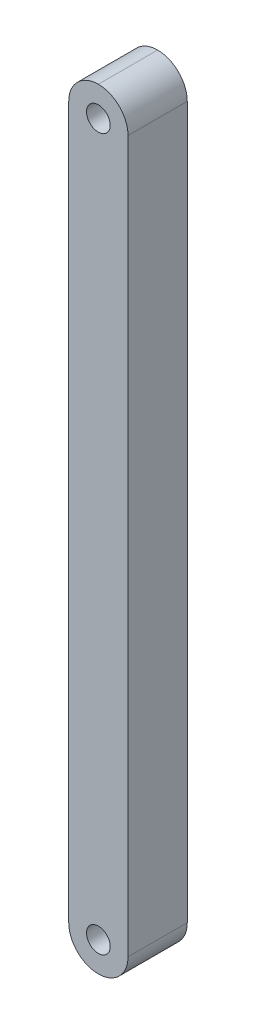
ISO-10303-21;
HEADER;
FILE_DESCRIPTION(('STEP AP214'),'2;1');
FILE_NAME('part.step','',(''),(''),'','','');
FILE_SCHEMA(('AUTOMOTIVE_DESIGN { 1 0 10303 214 1 1 1 1 }'));
ENDSEC;
DATA;
#1=APPLICATION_CONTEXT('core data for automotive mechanical design processes');
#2=APPLICATION_PROTOCOL_DEFINITION('international standard','automotive_design',2000,#1);
#3=PRODUCT_CONTEXT('',#1,'mechanical');
#4=PRODUCT('Part','Part','',(#3));
#5=PRODUCT_RELATED_PRODUCT_CATEGORY('part','',(#4));
#6=PRODUCT_DEFINITION_FORMATION('','',#4);
#7=PRODUCT_DEFINITION_CONTEXT('part definition',#1,'design');
#8=PRODUCT_DEFINITION('design','',#6,#7);
#9=PRODUCT_DEFINITION_SHAPE('','',#8);
#10=(LENGTH_UNIT() NAMED_UNIT(*) SI_UNIT(.MILLI.,.METRE.));
#11=(NAMED_UNIT(*) PLANE_ANGLE_UNIT() SI_UNIT($,.RADIAN.));
#12=(NAMED_UNIT(*) SI_UNIT($,.STERADIAN.) SOLID_ANGLE_UNIT());
#13=UNCERTAINTY_MEASURE_WITH_UNIT(LENGTH_MEASURE(1.E-05),#10,'distance_accuracy_value','');
#14=(GEOMETRIC_REPRESENTATION_CONTEXT(3) GLOBAL_UNCERTAINTY_ASSIGNED_CONTEXT((#13)) GLOBAL_UNIT_ASSIGNED_CONTEXT((#10,
#11,#12)) REPRESENTATION_CONTEXT('',''));
#15=CARTESIAN_POINT('',(0.,0.,0.));
#16=DIRECTION('',(0.,0.,1.));
#17=DIRECTION('',(1.,0.,0.));
#18=AXIS2_PLACEMENT_3D('',#15,#16,#17);
#19=CARTESIAN_POINT('',(0.,0.,10.));
#20=DIRECTION('',(1.,0.,0.));
#21=DIRECTION('',(0.,0.,-1.));
#22=AXIS2_PLACEMENT_3D('',#19,#20,#21);
#23=PLANE('',#22);
#24=DIRECTION('',(0.,-1.,0.));
#25=VECTOR('',#24,1.);
#26=CARTESIAN_POINT('',(0.,0.,0.));
#27=LINE('',#26,#25);
#28=CARTESIAN_POINT('',(0.,125.,0.));
#29=VERTEX_POINT('',#28);
#30=CARTESIAN_POINT('',(0.,5.,0.));
#31=VERTEX_POINT('',#30);
#32=EDGE_CURVE('E114',#29,#31,#27,.T.);
#33=ORIENTED_EDGE('',*,*,#32,.T.);
#34=DIRECTION('',(0.,0.,-1.));
#35=VECTOR('',#34,1.);
#36=CARTESIAN_POINT('',(0.,5.,10.));
#37=LINE('',#36,#35);
#38=CARTESIAN_POINT('',(0.,5.,10.));
#39=VERTEX_POINT('',#38);
#40=EDGE_CURVE('E11',#31,#39,#37,.F.);
#41=ORIENTED_EDGE('',*,*,#40,.T.);
#42=DIRECTION('',(0.,-1.,0.));
#43=VECTOR('',#42,1.);
#44=CARTESIAN_POINT('',(0.,0.,10.));
#45=LINE('',#44,#43);
#46=CARTESIAN_POINT('',(0.,125.,10.));
#47=VERTEX_POINT('',#46);
#48=EDGE_CURVE('E113',#47,#39,#45,.T.);
#49=ORIENTED_EDGE('',*,*,#48,.F.);
#50=DIRECTION('',(0.,0.,-1.));
#51=VECTOR('',#50,1.);
#52=CARTESIAN_POINT('',(0.,125.,10.));
#53=LINE('',#52,#51);
#54=EDGE_CURVE('E42',#47,#29,#53,.T.);
#55=ORIENTED_EDGE('',*,*,#54,.T.);
#56=EDGE_LOOP('',(#33,#41,#49,#55));
#57=FACE_BOUND('',#56,.T.);
#58=ADVANCED_FACE('F33',(#57),#23,.F.);
#59=CARTESIAN_POINT('',(10.,0.,10.));
#60=DIRECTION('',(-1.,0.,0.));
#61=DIRECTION('',(0.,0.,1.));
#62=AXIS2_PLACEMENT_3D('',#59,#60,#61);
#63=PLANE('',#62);
#64=DIRECTION('',(0.,1.,0.));
#65=VECTOR('',#64,1.);
#66=CARTESIAN_POINT('',(10.,0.,10.));
#67=LINE('',#66,#65);
#68=CARTESIAN_POINT('',(10.,5.,10.));
#69=VERTEX_POINT('',#68);
#70=CARTESIAN_POINT('',(10.,125.,10.));
#71=VERTEX_POINT('',#70);
#72=EDGE_CURVE('E106',#69,#71,#67,.T.);
#73=ORIENTED_EDGE('',*,*,#72,.F.);
#74=DIRECTION('',(0.,0.,-1.));
#75=VECTOR('',#74,1.);
#76=CARTESIAN_POINT('',(10.,5.,10.));
#77=LINE('',#76,#75);
#78=CARTESIAN_POINT('',(10.,5.,0.));
#79=VERTEX_POINT('',#78);
#80=EDGE_CURVE('E91',#69,#79,#77,.T.);
#81=ORIENTED_EDGE('',*,*,#80,.T.);
#82=DIRECTION('',(0.,1.,0.));
#83=VECTOR('',#82,1.);
#84=CARTESIAN_POINT('',(10.,0.,0.));
#85=LINE('',#84,#83);
#86=CARTESIAN_POINT('',(10.,125.,0.));
#87=VERTEX_POINT('',#86);
#88=EDGE_CURVE('E104',#79,#87,#85,.T.);
#89=ORIENTED_EDGE('',*,*,#88,.T.);
#90=DIRECTION('',(0.,0.,-1.));
#91=VECTOR('',#90,1.);
#92=CARTESIAN_POINT('',(10.,125.,10.));
#93=LINE('',#92,#91);
#94=EDGE_CURVE('E108',#87,#71,#93,.F.);
#95=ORIENTED_EDGE('',*,*,#94,.T.);
#96=EDGE_LOOP('',(#73,#81,#89,#95));
#97=FACE_BOUND('',#96,.T.);
#98=ADVANCED_FACE('F102',(#97),#63,.F.);
#99=CARTESIAN_POINT('',(0.,0.,10.));
#100=DIRECTION('',(0.,0.,-1.));
#101=DIRECTION('',(-1.,0.,0.));
#102=AXIS2_PLACEMENT_3D('',#99,#100,#101);
#103=PLANE('',#102);
#104=CARTESIAN_POINT('',(5.,5.,10.));
#105=DIRECTION('',(0.,0.,1.));
#106=DIRECTION('',(1.,0.,0.));
#107=AXIS2_PLACEMENT_3D('',#104,#105,#106);
#108=CIRCLE('',#107,2.);
#109=CARTESIAN_POINT('',(7.,5.,10.));
#110=VERTEX_POINT('',#109);
#111=EDGE_CURVE('E131',#110,#110,#108,.T.);
#112=ORIENTED_EDGE('',*,*,#111,.F.);
#113=EDGE_LOOP('',(#112));
#114=FACE_BOUND('',#113,.T.);
#115=CARTESIAN_POINT('',(5.,125.,10.));
#116=DIRECTION('',(0.,0.,1.));
#117=DIRECTION('',(1.,0.,0.));
#118=AXIS2_PLACEMENT_3D('',#115,#116,#117);
#119=CIRCLE('',#118,2.);
#120=CARTESIAN_POINT('',(7.,125.,10.));
#121=VERTEX_POINT('',#120);
#122=EDGE_CURVE('E150',#121,#121,#119,.T.);
#123=ORIENTED_EDGE('',*,*,#122,.F.);
#124=EDGE_LOOP('',(#123));
#125=FACE_BOUND('',#124,.T.);
#126=CARTESIAN_POINT('',(5.,5.,10.));
#127=DIRECTION('',(0.,0.,-1.));
#128=DIRECTION('',(-1.,0.,0.));
#129=AXIS2_PLACEMENT_3D('',#126,#127,#128);
#130=CIRCLE('',#129,5.);
#131=CARTESIAN_POINT('',(5.,0.,10.));
#132=VERTEX_POINT('',#131);
#133=EDGE_CURVE('E57',#39,#132,#130,.F.);
#134=ORIENTED_EDGE('',*,*,#133,.T.);
#135=CARTESIAN_POINT('',(5.,5.,10.));
#136=DIRECTION('',(0.,0.,-1.));
#137=DIRECTION('',(-1.,0.,0.));
#138=AXIS2_PLACEMENT_3D('',#135,#136,#137);
#139=CIRCLE('',#138,5.);
#140=EDGE_CURVE('E129',#132,#69,#139,.F.);
#141=ORIENTED_EDGE('',*,*,#140,.T.);
#142=ORIENTED_EDGE('',*,*,#72,.T.);
#143=CARTESIAN_POINT('',(5.,125.,10.));
#144=DIRECTION('',(0.,0.,-1.));
#145=DIRECTION('',(-1.,0.,0.));
#146=AXIS2_PLACEMENT_3D('',#143,#144,#145);
#147=CIRCLE('',#146,5.);
#148=CARTESIAN_POINT('',(5.,130.,10.));
#149=VERTEX_POINT('',#148);
#150=EDGE_CURVE('E50',#71,#149,#147,.F.);
#151=ORIENTED_EDGE('',*,*,#150,.T.);
#152=CARTESIAN_POINT('',(5.,125.,10.));
#153=DIRECTION('',(0.,0.,-1.));
#154=DIRECTION('',(-1.,0.,0.));
#155=AXIS2_PLACEMENT_3D('',#152,#153,#154);
#156=CIRCLE('',#155,5.);
#157=EDGE_CURVE('E96',#149,#47,#156,.F.);
#158=ORIENTED_EDGE('',*,*,#157,.T.);
#159=ORIENTED_EDGE('',*,*,#48,.T.);
#160=EDGE_LOOP('',(#134,#141,#142,#151,#158,#159));
#161=FACE_BOUND('',#160,.T.);
#162=ADVANCED_FACE('F143',(#114,#125,#161),#103,.F.);
#163=CARTESIAN_POINT('',(0.,0.,0.));
#164=DIRECTION('',(0.,0.,-1.));
#165=DIRECTION('',(-1.,0.,0.));
#166=AXIS2_PLACEMENT_3D('',#163,#164,#165);
#167=PLANE('',#166);
#168=CARTESIAN_POINT('',(5.,5.,0.));
#169=DIRECTION('',(0.,0.,1.));
#170=DIRECTION('',(1.,0.,0.));
#171=AXIS2_PLACEMENT_3D('',#168,#169,#170);
#172=CIRCLE('',#171,2.);
#173=CARTESIAN_POINT('',(7.,5.,0.));
#174=VERTEX_POINT('',#173);
#175=EDGE_CURVE('E133',#174,#174,#172,.T.);
#176=ORIENTED_EDGE('',*,*,#175,.T.);
#177=EDGE_LOOP('',(#176));
#178=FACE_BOUND('',#177,.T.);
#179=CARTESIAN_POINT('',(5.,125.,0.));
#180=DIRECTION('',(0.,0.,1.));
#181=DIRECTION('',(1.,0.,0.));
#182=AXIS2_PLACEMENT_3D('',#179,#180,#181);
#183=CIRCLE('',#182,2.);
#184=CARTESIAN_POINT('',(7.,125.,0.));
#185=VERTEX_POINT('',#184);
#186=EDGE_CURVE('E118',#185,#185,#183,.T.);
#187=ORIENTED_EDGE('',*,*,#186,.T.);
#188=EDGE_LOOP('',(#187));
#189=FACE_BOUND('',#188,.T.);
#190=ORIENTED_EDGE('',*,*,#88,.F.);
#191=CARTESIAN_POINT('',(5.,5.,0.));
#192=DIRECTION('',(0.,0.,-1.));
#193=DIRECTION('',(-1.,0.,0.));
#194=AXIS2_PLACEMENT_3D('',#191,#192,#193);
#195=CIRCLE('',#194,5.);
#196=CARTESIAN_POINT('',(5.,0.,0.));
#197=VERTEX_POINT('',#196);
#198=EDGE_CURVE('E87',#79,#197,#195,.T.);
#199=ORIENTED_EDGE('',*,*,#198,.T.);
#200=CARTESIAN_POINT('',(5.,5.,0.));
#201=DIRECTION('',(0.,0.,-1.));
#202=DIRECTION('',(-1.,0.,0.));
#203=AXIS2_PLACEMENT_3D('',#200,#201,#202);
#204=CIRCLE('',#203,5.);
#205=EDGE_CURVE('E97',#197,#31,#204,.T.);
#206=ORIENTED_EDGE('',*,*,#205,.T.);
#207=ORIENTED_EDGE('',*,*,#32,.F.);
#208=CARTESIAN_POINT('',(5.,125.,0.));
#209=DIRECTION('',(0.,0.,-1.));
#210=DIRECTION('',(-1.,0.,0.));
#211=AXIS2_PLACEMENT_3D('',#208,#209,#210);
#212=CIRCLE('',#211,5.);
#213=CARTESIAN_POINT('',(5.,130.,0.));
#214=VERTEX_POINT('',#213);
#215=EDGE_CURVE('E107',#29,#214,#212,.T.);
#216=ORIENTED_EDGE('',*,*,#215,.T.);
#217=CARTESIAN_POINT('',(5.,125.,0.));
#218=DIRECTION('',(0.,0.,-1.));
#219=DIRECTION('',(-1.,0.,0.));
#220=AXIS2_PLACEMENT_3D('',#217,#218,#219);
#221=CIRCLE('',#220,5.);
#222=EDGE_CURVE('E112',#214,#87,#221,.T.);
#223=ORIENTED_EDGE('',*,*,#222,.T.);
#224=EDGE_LOOP('',(#190,#199,#206,#207,#216,#223));
#225=FACE_BOUND('',#224,.T.);
#226=ADVANCED_FACE('F110',(#178,#189,#225),#167,.T.);
#227=CARTESIAN_POINT('',(5.,125.,0.));
#228=DIRECTION('',(0.,0.,1.));
#229=DIRECTION('',(1.,0.,0.));
#230=AXIS2_PLACEMENT_3D('',#227,#228,#229);
#231=CYLINDRICAL_SURFACE('',#230,2.);
#232=ORIENTED_EDGE('',*,*,#186,.F.);
#233=EDGE_LOOP('',(#232));
#234=FACE_BOUND('',#233,.T.);
#235=ORIENTED_EDGE('',*,*,#122,.T.);
#236=EDGE_LOOP('',(#235));
#237=FACE_BOUND('',#236,.T.);
#238=ADVANCED_FACE('F163',(#234,#237),#231,.F.);
#239=CARTESIAN_POINT('',(5.,5.,0.));
#240=DIRECTION('',(0.,0.,1.));
#241=DIRECTION('',(1.,0.,0.));
#242=AXIS2_PLACEMENT_3D('',#239,#240,#241);
#243=CYLINDRICAL_SURFACE('',#242,2.);
#244=ORIENTED_EDGE('',*,*,#175,.F.);
#245=EDGE_LOOP('',(#244));
#246=FACE_BOUND('',#245,.T.);
#247=ORIENTED_EDGE('',*,*,#111,.T.);
#248=EDGE_LOOP('',(#247));
#249=FACE_BOUND('',#248,.T.);
#250=ADVANCED_FACE('F160',(#246,#249),#243,.F.);
#251=CARTESIAN_POINT('',(5.,5.,10.));
#252=DIRECTION('',(0.,0.,-1.));
#253=DIRECTION('',(-1.,0.,0.));
#254=AXIS2_PLACEMENT_3D('',#251,#252,#253);
#255=CYLINDRICAL_SURFACE('',#254,5.);
#256=DIRECTION('',(0.,0.,-1.));
#257=VECTOR('',#256,1.);
#258=CARTESIAN_POINT('',(5.,0.,10.));
#259=LINE('',#258,#257);
#260=EDGE_CURVE('E92',#132,#197,#259,.T.);
#261=ORIENTED_EDGE('',*,*,#260,.F.);
#262=ORIENTED_EDGE('',*,*,#133,.F.);
#263=ORIENTED_EDGE('',*,*,#40,.F.);
#264=ORIENTED_EDGE('',*,*,#205,.F.);
#265=EDGE_LOOP('',(#261,#262,#263,#264));
#266=FACE_BOUND('',#265,.T.);
#267=ADVANCED_FACE('F148',(#266),#255,.T.);
#268=CARTESIAN_POINT('',(5.,5.,10.));
#269=DIRECTION('',(0.,0.,-1.));
#270=DIRECTION('',(-1.,0.,0.));
#271=AXIS2_PLACEMENT_3D('',#268,#269,#270);
#272=CYLINDRICAL_SURFACE('',#271,5.);
#273=ORIENTED_EDGE('',*,*,#140,.F.);
#274=ORIENTED_EDGE('',*,*,#260,.T.);
#275=ORIENTED_EDGE('',*,*,#198,.F.);
#276=ORIENTED_EDGE('',*,*,#80,.F.);
#277=EDGE_LOOP('',(#273,#274,#275,#276));
#278=FACE_BOUND('',#277,.T.);
#279=ADVANCED_FACE('F90',(#278),#272,.T.);
#280=CARTESIAN_POINT('',(5.,125.,10.));
#281=DIRECTION('',(0.,0.,-1.));
#282=DIRECTION('',(-1.,0.,0.));
#283=AXIS2_PLACEMENT_3D('',#280,#281,#282);
#284=CYLINDRICAL_SURFACE('',#283,5.);
#285=ORIENTED_EDGE('',*,*,#54,.F.);
#286=ORIENTED_EDGE('',*,*,#157,.F.);
#287=DIRECTION('',(0.,0.,-1.));
#288=VECTOR('',#287,1.);
#289=CARTESIAN_POINT('',(5.,130.,10.));
#290=LINE('',#289,#288);
#291=EDGE_CURVE('E37',#214,#149,#290,.F.);
#292=ORIENTED_EDGE('',*,*,#291,.F.);
#293=ORIENTED_EDGE('',*,*,#215,.F.);
#294=EDGE_LOOP('',(#285,#286,#292,#293));
#295=FACE_BOUND('',#294,.T.);
#296=ADVANCED_FACE('F35',(#295),#284,.T.);
#297=CARTESIAN_POINT('',(5.,125.,10.));
#298=DIRECTION('',(0.,0.,-1.));
#299=DIRECTION('',(-1.,0.,0.));
#300=AXIS2_PLACEMENT_3D('',#297,#298,#299);
#301=CYLINDRICAL_SURFACE('',#300,5.);
#302=ORIENTED_EDGE('',*,*,#150,.F.);
#303=ORIENTED_EDGE('',*,*,#94,.F.);
#304=ORIENTED_EDGE('',*,*,#222,.F.);
#305=ORIENTED_EDGE('',*,*,#291,.T.);
#306=EDGE_LOOP('',(#302,#303,#304,#305));
#307=FACE_BOUND('',#306,.T.);
#308=ADVANCED_FACE('F138',(#307),#301,.T.);
#309=CLOSED_SHELL('',(#58,#98,#162,#226,#238,#250,#267,#279,#296,#308));
#310=MANIFOLD_SOLID_BREP('B2',#309);
#311=ADVANCED_BREP_SHAPE_REPRESENTATION('',(#18,#310),#14);
#312=SHAPE_DEFINITION_REPRESENTATION(#9,#311);
ENDSEC;
END-ISO-10303-21;
